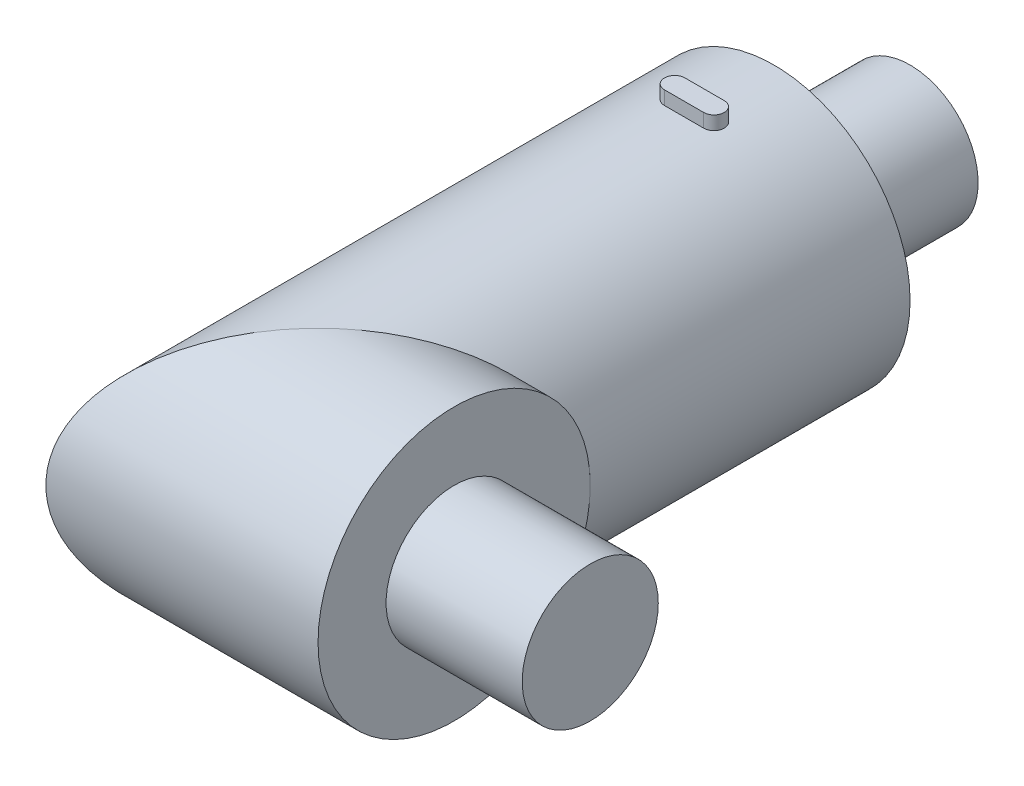
ISO-10303-21;
HEADER;
FILE_DESCRIPTION(('STEP AP214'),'2;1');
FILE_NAME('part.step','',(''),(''),'','','');
FILE_SCHEMA(('AUTOMOTIVE_DESIGN { 1 0 10303 214 1 1 1 1 }'));
ENDSEC;
DATA;
#1=APPLICATION_CONTEXT('core data for automotive mechanical design processes');
#2=APPLICATION_PROTOCOL_DEFINITION('international standard','automotive_design',2000,#1);
#3=PRODUCT_CONTEXT('',#1,'mechanical');
#4=PRODUCT('Part','Part','',(#3));
#5=PRODUCT_RELATED_PRODUCT_CATEGORY('part','',(#4));
#6=PRODUCT_DEFINITION_FORMATION('','',#4);
#7=PRODUCT_DEFINITION_CONTEXT('part definition',#1,'design');
#8=PRODUCT_DEFINITION('design','',#6,#7);
#9=PRODUCT_DEFINITION_SHAPE('','',#8);
#10=(LENGTH_UNIT() NAMED_UNIT(*) SI_UNIT(.MILLI.,.METRE.));
#11=(NAMED_UNIT(*) PLANE_ANGLE_UNIT() SI_UNIT($,.RADIAN.));
#12=(NAMED_UNIT(*) SI_UNIT($,.STERADIAN.) SOLID_ANGLE_UNIT());
#13=UNCERTAINTY_MEASURE_WITH_UNIT(LENGTH_MEASURE(1.E-05),#10,'distance_accuracy_value','');
#14=(GEOMETRIC_REPRESENTATION_CONTEXT(3) GLOBAL_UNCERTAINTY_ASSIGNED_CONTEXT((#13)) GLOBAL_UNIT_ASSIGNED_CONTEXT((#10,
#11,#12)) REPRESENTATION_CONTEXT('',''));
#15=CARTESIAN_POINT('',(0.,0.,0.));
#16=DIRECTION('',(0.,0.,1.));
#17=DIRECTION('',(1.,0.,0.));
#18=AXIS2_PLACEMENT_3D('',#15,#16,#17);
#19=CARTESIAN_POINT('',(-22.8858115165429,22.,-55.2979829256467));
#20=DIRECTION('',(0.,-1.,0.));
#21=DIRECTION('',(0.,0.,-1.));
#22=AXIS2_PLACEMENT_3D('',#19,#20,#21);
#23=CYLINDRICAL_SURFACE('',#22,1.50934466475096);
#24=CARTESIAN_POINT('',(-22.8858115165429,20.,-55.2979829256467));
#25=DIRECTION('',(0.,1.,0.));
#26=DIRECTION('',(0.,0.,1.));
#27=AXIS2_PLACEMENT_3D('',#24,#25,#26);
#28=CIRCLE('',#27,1.50934466475096);
#29=CARTESIAN_POINT('',(-22.8858115165429,20.,-56.8073275903977));
#30=VERTEX_POINT('',#29);
#31=CARTESIAN_POINT('',(-22.8858115165429,20.,-53.7886382608957));
#32=VERTEX_POINT('',#31);
#33=EDGE_CURVE('E117',#30,#32,#28,.T.);
#34=ORIENTED_EDGE('',*,*,#33,.T.);
#35=DIRECTION('',(0.,-1.,0.));
#36=VECTOR('',#35,1.);
#37=CARTESIAN_POINT('',(-22.8858115165429,22.,-53.7886382608957));
#38=LINE('',#37,#36);
#39=CARTESIAN_POINT('',(-22.8858115165429,22.,-53.7886382608957));
#40=VERTEX_POINT('',#39);
#41=EDGE_CURVE('E12',#40,#32,#38,.T.);
#42=ORIENTED_EDGE('',*,*,#41,.F.);
#43=CARTESIAN_POINT('',(-22.8858115165429,22.,-55.2979829256467));
#44=DIRECTION('',(0.,1.,0.));
#45=DIRECTION('',(0.,0.,1.));
#46=AXIS2_PLACEMENT_3D('',#43,#44,#45);
#47=CIRCLE('',#46,1.50934466475096);
#48=CARTESIAN_POINT('',(-22.8858115165429,22.,-56.8073275903977));
#49=VERTEX_POINT('',#48);
#50=EDGE_CURVE('E105',#49,#40,#47,.T.);
#51=ORIENTED_EDGE('',*,*,#50,.F.);
#52=DIRECTION('',(0.,-1.,0.));
#53=VECTOR('',#52,1.);
#54=CARTESIAN_POINT('',(-22.8858115165429,22.,-56.8073275903977));
#55=LINE('',#54,#53);
#56=EDGE_CURVE('E113',#49,#30,#55,.T.);
#57=ORIENTED_EDGE('',*,*,#56,.T.);
#58=EDGE_LOOP('',(#34,#42,#51,#57));
#59=FACE_BOUND('',#58,.T.);
#60=ADVANCED_FACE('F54',(#59),#23,.T.);
#61=CARTESIAN_POINT('',(-22.8858115165429,22.,-53.7886382608957));
#62=DIRECTION('',(0.,0.,-1.));
#63=DIRECTION('',(-1.,0.,0.));
#64=AXIS2_PLACEMENT_3D('',#61,#62,#63);
#65=PLANE('',#64);
#66=DIRECTION('',(1.,0.,0.));
#67=VECTOR('',#66,1.);
#68=CARTESIAN_POINT('',(-22.8858115165429,20.,-53.7886382608957));
#69=LINE('',#68,#67);
#70=CARTESIAN_POINT('',(-17.1141884834571,20.,-53.7886382608957));
#71=VERTEX_POINT('',#70);
#72=EDGE_CURVE('E109',#32,#71,#69,.T.);
#73=ORIENTED_EDGE('',*,*,#72,.T.);
#74=DIRECTION('',(0.,-1.,0.));
#75=VECTOR('',#74,1.);
#76=CARTESIAN_POINT('',(-17.1141884834571,22.,-53.7886382608957));
#77=LINE('',#76,#75);
#78=CARTESIAN_POINT('',(-17.1141884834571,22.,-53.7886382608957));
#79=VERTEX_POINT('',#78);
#80=EDGE_CURVE('E62',#79,#71,#77,.T.);
#81=ORIENTED_EDGE('',*,*,#80,.F.);
#82=DIRECTION('',(1.,0.,0.));
#83=VECTOR('',#82,1.);
#84=CARTESIAN_POINT('',(-22.8858115165429,22.,-53.7886382608957));
#85=LINE('',#84,#83);
#86=EDGE_CURVE('E100',#40,#79,#85,.T.);
#87=ORIENTED_EDGE('',*,*,#86,.F.);
#88=ORIENTED_EDGE('',*,*,#41,.T.);
#89=EDGE_LOOP('',(#73,#81,#87,#88));
#90=FACE_BOUND('',#89,.T.);
#91=ADVANCED_FACE('F108',(#90),#65,.F.);
#92=CARTESIAN_POINT('',(-17.1141884834571,22.,-55.2979829256467));
#93=DIRECTION('',(0.,-1.,0.));
#94=DIRECTION('',(0.,0.,-1.));
#95=AXIS2_PLACEMENT_3D('',#92,#93,#94);
#96=CYLINDRICAL_SURFACE('',#95,1.50934466475096);
#97=CARTESIAN_POINT('',(-17.1141884834571,20.,-55.2979829256467));
#98=DIRECTION('',(0.,1.,0.));
#99=DIRECTION('',(0.,0.,1.));
#100=AXIS2_PLACEMENT_3D('',#97,#98,#99);
#101=CIRCLE('',#100,1.50934466475096);
#102=CARTESIAN_POINT('',(-17.1141884834571,20.,-56.8073275903977));
#103=VERTEX_POINT('',#102);
#104=EDGE_CURVE('E87',#71,#103,#101,.T.);
#105=ORIENTED_EDGE('',*,*,#104,.T.);
#106=DIRECTION('',(0.,-1.,0.));
#107=VECTOR('',#106,1.);
#108=CARTESIAN_POINT('',(-17.1141884834571,22.,-56.8073275903977));
#109=LINE('',#108,#107);
#110=CARTESIAN_POINT('',(-17.1141884834571,22.,-56.8073275903977));
#111=VERTEX_POINT('',#110);
#112=EDGE_CURVE('E110',#111,#103,#109,.T.);
#113=ORIENTED_EDGE('',*,*,#112,.F.);
#114=CARTESIAN_POINT('',(-17.1141884834571,22.,-55.2979829256467));
#115=DIRECTION('',(0.,1.,0.));
#116=DIRECTION('',(0.,0.,1.));
#117=AXIS2_PLACEMENT_3D('',#114,#115,#116);
#118=CIRCLE('',#117,1.50934466475096);
#119=EDGE_CURVE('E103',#79,#111,#118,.T.);
#120=ORIENTED_EDGE('',*,*,#119,.F.);
#121=ORIENTED_EDGE('',*,*,#80,.T.);
#122=EDGE_LOOP('',(#105,#113,#120,#121));
#123=FACE_BOUND('',#122,.T.);
#124=ADVANCED_FACE('F111',(#123),#96,.T.);
#125=CARTESIAN_POINT('',(-22.8858115165429,22.,-56.8073275903977));
#126=DIRECTION('',(0.,0.,1.));
#127=DIRECTION('',(1.,0.,0.));
#128=AXIS2_PLACEMENT_3D('',#125,#126,#127);
#129=PLANE('',#128);
#130=DIRECTION('',(-1.,0.,0.));
#131=VECTOR('',#130,1.);
#132=CARTESIAN_POINT('',(-22.8858115165429,20.,-56.8073275903977));
#133=LINE('',#132,#131);
#134=EDGE_CURVE('E93',#103,#30,#133,.T.);
#135=ORIENTED_EDGE('',*,*,#134,.T.);
#136=ORIENTED_EDGE('',*,*,#56,.F.);
#137=DIRECTION('',(-1.,0.,0.));
#138=VECTOR('',#137,1.);
#139=CARTESIAN_POINT('',(-22.8858115165429,22.,-56.8073275903977));
#140=LINE('',#139,#138);
#141=EDGE_CURVE('E70',#111,#49,#140,.T.);
#142=ORIENTED_EDGE('',*,*,#141,.F.);
#143=ORIENTED_EDGE('',*,*,#112,.T.);
#144=EDGE_LOOP('',(#135,#136,#142,#143));
#145=FACE_BOUND('',#144,.T.);
#146=ADVANCED_FACE('F124',(#145),#129,.F.);
#147=CARTESIAN_POINT('',(-22.8858115165429,22.,-55.2979829256467));
#148=DIRECTION('',(0.,1.,0.));
#149=DIRECTION('',(0.,0.,1.));
#150=AXIS2_PLACEMENT_3D('',#147,#148,#149);
#151=PLANE('',#150);
#152=ORIENTED_EDGE('',*,*,#50,.T.);
#153=ORIENTED_EDGE('',*,*,#86,.T.);
#154=ORIENTED_EDGE('',*,*,#119,.T.);
#155=ORIENTED_EDGE('',*,*,#141,.T.);
#156=EDGE_LOOP('',(#152,#153,#154,#155));
#157=FACE_BOUND('',#156,.T.);
#158=ADVANCED_FACE('F101',(#157),#151,.T.);
#159=CARTESIAN_POINT('',(-22.8858115165429,20.,-55.2979829256467));
#160=DIRECTION('',(0.,1.,0.));
#161=DIRECTION('',(0.,0.,1.));
#162=AXIS2_PLACEMENT_3D('',#159,#160,#161);
#163=PLANE('',#162);
#164=ORIENTED_EDGE('',*,*,#33,.F.);
#165=ORIENTED_EDGE('',*,*,#134,.F.);
#166=ORIENTED_EDGE('',*,*,#104,.F.);
#167=ORIENTED_EDGE('',*,*,#72,.F.);
#168=EDGE_LOOP('',(#164,#165,#166,#167));
#169=FACE_BOUND('',#168,.T.);
#170=ADVANCED_FACE('F127',(#169),#163,.F.);
#171=CLOSED_SHELL('',(#60,#91,#124,#146,#158,#170));
#172=MANIFOLD_SOLID_BREP('B2',#171);
#173=CARTESIAN_POINT('',(-20.,0.,-67.));
#174=DIRECTION('',(0.,0.,1.));
#175=DIRECTION('',(1.,0.,0.));
#176=AXIS2_PLACEMENT_3D('',#173,#174,#175);
#177=PLANE('',#176);
#178=CARTESIAN_POINT('',(-20.,0.,-67.));
#179=DIRECTION('',(0.,0.,-1.));
#180=DIRECTION('',(-1.,0.,0.));
#181=AXIS2_PLACEMENT_3D('',#178,#179,#180);
#182=CIRCLE('',#181,10.);
#183=CARTESIAN_POINT('',(-30.,0.,-67.));
#184=VERTEX_POINT('',#183);
#185=EDGE_CURVE('E52',#184,#184,#182,.T.);
#186=ORIENTED_EDGE('',*,*,#185,.F.);
#187=EDGE_LOOP('',(#186));
#188=FACE_BOUND('',#187,.T.);
#189=CARTESIAN_POINT('',(-20.,0.,-67.));
#190=DIRECTION('',(0.,0.,1.));
#191=DIRECTION('',(1.,0.,0.));
#192=AXIS2_PLACEMENT_3D('',#189,#190,#191);
#193=CIRCLE('',#192,20.);
#194=CARTESIAN_POINT('',(0.,0.,-67.));
#195=VERTEX_POINT('',#194);
#196=EDGE_CURVE('E192',#195,#195,#193,.T.);
#197=ORIENTED_EDGE('',*,*,#196,.F.);
#198=EDGE_LOOP('',(#197));
#199=FACE_BOUND('',#198,.T.);
#200=ADVANCED_FACE('F189',(#188,#199),#177,.F.);
#201=CARTESIAN_POINT('',(0.,0.,0.));
#202=DIRECTION('',(1.,0.,0.));
#203=DIRECTION('',(0.,0.,-1.));
#204=AXIS2_PLACEMENT_3D('',#201,#202,#203);
#205=PLANE('',#204);
#206=CARTESIAN_POINT('',(0.,0.,0.));
#207=DIRECTION('',(1.,0.,0.));
#208=DIRECTION('',(0.,0.,-1.));
#209=AXIS2_PLACEMENT_3D('',#206,#207,#208);
#210=CIRCLE('',#209,10.);
#211=CARTESIAN_POINT('',(0.,0.,-10.));
#212=VERTEX_POINT('',#211);
#213=EDGE_CURVE('E214',#212,#212,#210,.T.);
#214=ORIENTED_EDGE('',*,*,#213,.F.);
#215=EDGE_LOOP('',(#214));
#216=FACE_BOUND('',#215,.T.);
#217=CARTESIAN_POINT('',(0.,0.,0.));
#218=DIRECTION('',(1.,0.,0.));
#219=DIRECTION('',(0.,0.,-1.));
#220=AXIS2_PLACEMENT_3D('',#217,#218,#219);
#221=CIRCLE('',#220,20.);
#222=CARTESIAN_POINT('',(0.,0.,-20.));
#223=VERTEX_POINT('',#222);
#224=EDGE_CURVE('E203',#223,#223,#221,.T.);
#225=ORIENTED_EDGE('',*,*,#224,.T.);
#226=EDGE_LOOP('',(#225));
#227=FACE_BOUND('',#226,.T.);
#228=ADVANCED_FACE('F237',(#216,#227),#205,.T.);
#229=CARTESIAN_POINT('',(-20.,0.,22.1));
#230=DIRECTION('',(0.,0.,-1.));
#231=DIRECTION('',(-1.,0.,0.));
#232=AXIS2_PLACEMENT_3D('',#229,#230,#231);
#233=CYLINDRICAL_SURFACE('',#232,20.);
#234=CARTESIAN_POINT('',(-20.,0.,0.));
#235=DIRECTION('',(-0.707106781186547,0.,-0.707106781186547));
#236=DIRECTION('',(-0.707106781186548,0.,0.707106781186548));
#237=AXIS2_PLACEMENT_3D('',#234,#235,#236);
#238=ELLIPSE('',#237,28.2842712474619,20.);
#239=EDGE_CURVE('E197',#223,#223,#238,.T.);
#240=ORIENTED_EDGE('',*,*,#239,.T.);
#241=EDGE_LOOP('',(#240));
#242=FACE_BOUND('',#241,.T.);
#243=ORIENTED_EDGE('',*,*,#196,.T.);
#244=EDGE_LOOP('',(#243));
#245=FACE_BOUND('',#244,.T.);
#246=ADVANCED_FACE('F241',(#242,#245),#233,.T.);
#247=CARTESIAN_POINT('',(0.,0.,0.));
#248=DIRECTION('',(-1.,0.,0.));
#249=DIRECTION('',(0.,0.,1.));
#250=AXIS2_PLACEMENT_3D('',#247,#248,#249);
#251=CYLINDRICAL_SURFACE('',#250,20.);
#252=ORIENTED_EDGE('',*,*,#224,.F.);
#253=ORIENTED_EDGE('',*,*,#239,.F.);
#254=EDGE_LOOP('',(#252,#253));
#255=FACE_BOUND('',#254,.T.);
#256=ADVANCED_FACE('F204',(#255),#251,.T.);
#257=CARTESIAN_POINT('',(20.,0.,0.));
#258=DIRECTION('',(-1.,0.,0.));
#259=DIRECTION('',(0.,0.,1.));
#260=AXIS2_PLACEMENT_3D('',#257,#258,#259);
#261=CYLINDRICAL_SURFACE('',#260,10.);
#262=CARTESIAN_POINT('',(20.,0.,0.));
#263=DIRECTION('',(1.,0.,0.));
#264=DIRECTION('',(0.,0.,-1.));
#265=AXIS2_PLACEMENT_3D('',#262,#263,#264);
#266=CIRCLE('',#265,10.);
#267=CARTESIAN_POINT('',(20.,0.,-10.));
#268=VERTEX_POINT('',#267);
#269=EDGE_CURVE('E212',#268,#268,#266,.T.);
#270=ORIENTED_EDGE('',*,*,#269,.F.);
#271=EDGE_LOOP('',(#270));
#272=FACE_BOUND('',#271,.T.);
#273=ORIENTED_EDGE('',*,*,#213,.T.);
#274=EDGE_LOOP('',(#273));
#275=FACE_BOUND('',#274,.T.);
#276=ADVANCED_FACE('F238',(#272,#275),#261,.T.);
#277=CARTESIAN_POINT('',(20.,0.,0.));
#278=DIRECTION('',(1.,0.,0.));
#279=DIRECTION('',(0.,0.,-1.));
#280=AXIS2_PLACEMENT_3D('',#277,#278,#279);
#281=PLANE('',#280);
#282=ORIENTED_EDGE('',*,*,#269,.T.);
#283=EDGE_LOOP('',(#282));
#284=FACE_BOUND('',#283,.T.);
#285=ADVANCED_FACE('F231',(#284),#281,.T.);
#286=CARTESIAN_POINT('',(-20.,0.,-87.));
#287=DIRECTION('',(0.,0.,1.));
#288=DIRECTION('',(1.,0.,0.));
#289=AXIS2_PLACEMENT_3D('',#286,#287,#288);
#290=CYLINDRICAL_SURFACE('',#289,10.);
#291=CARTESIAN_POINT('',(-20.,0.,-87.));
#292=DIRECTION('',(0.,0.,-1.));
#293=DIRECTION('',(-1.,0.,0.));
#294=AXIS2_PLACEMENT_3D('',#291,#292,#293);
#295=CIRCLE('',#294,10.);
#296=CARTESIAN_POINT('',(-30.,0.,-87.));
#297=VERTEX_POINT('',#296);
#298=EDGE_CURVE('E218',#297,#297,#295,.T.);
#299=ORIENTED_EDGE('',*,*,#298,.F.);
#300=EDGE_LOOP('',(#299));
#301=FACE_BOUND('',#300,.T.);
#302=ORIENTED_EDGE('',*,*,#185,.T.);
#303=EDGE_LOOP('',(#302));
#304=FACE_BOUND('',#303,.T.);
#305=ADVANCED_FACE('F228',(#301,#304),#290,.T.);
#306=CARTESIAN_POINT('',(-20.,0.,-87.));
#307=DIRECTION('',(0.,0.,-1.));
#308=DIRECTION('',(-1.,0.,0.));
#309=AXIS2_PLACEMENT_3D('',#306,#307,#308);
#310=PLANE('',#309);
#311=ORIENTED_EDGE('',*,*,#298,.T.);
#312=EDGE_LOOP('',(#311));
#313=FACE_BOUND('',#312,.T.);
#314=ADVANCED_FACE('F226',(#313),#310,.T.);
#315=CLOSED_SHELL('',(#200,#228,#246,#256,#276,#285,#305,#314));
#316=MANIFOLD_SOLID_BREP('B6',#315);
#317=ADVANCED_BREP_SHAPE_REPRESENTATION('',(#18,#172,#316),#14);
#318=SHAPE_DEFINITION_REPRESENTATION(#9,#317);
ENDSEC;
END-ISO-10303-21;
